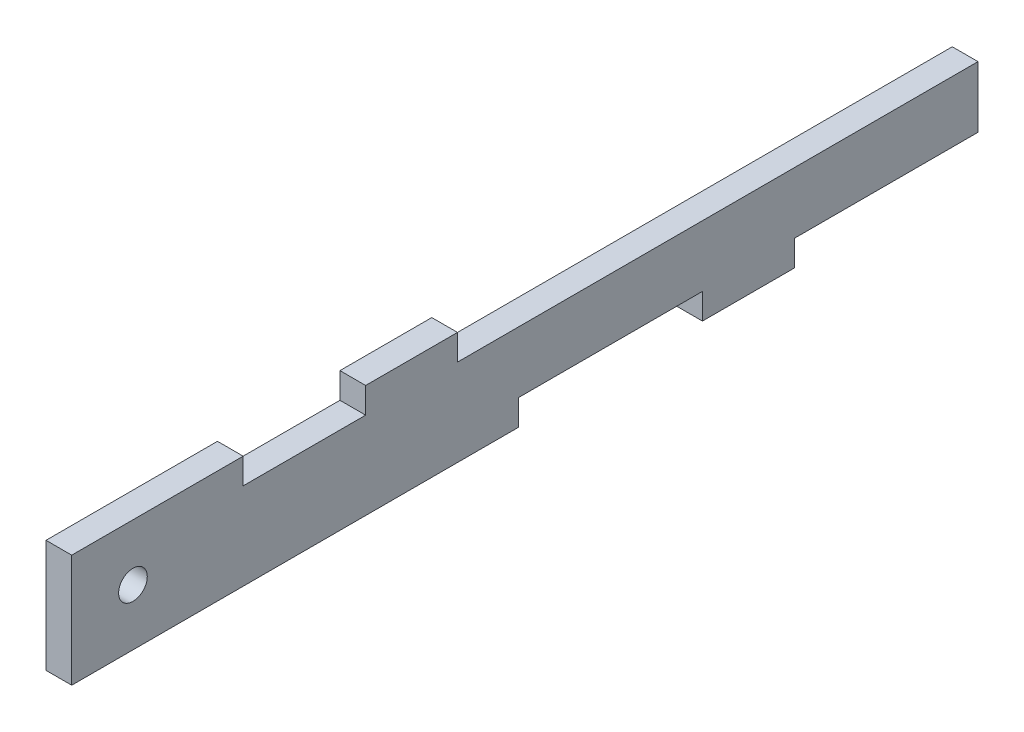
ISO-10303-21;
HEADER;
FILE_DESCRIPTION(('STEP AP214'),'2;1');
FILE_NAME('part.step','',(''),(''),'','','');
FILE_SCHEMA(('AUTOMOTIVE_DESIGN { 1 0 10303 214 1 1 1 1 }'));
ENDSEC;
DATA;
#1=APPLICATION_CONTEXT('core data for automotive mechanical design processes');
#2=APPLICATION_PROTOCOL_DEFINITION('international standard','automotive_design',2000,#1);
#3=PRODUCT_CONTEXT('',#1,'mechanical');
#4=PRODUCT('Part','Part','',(#3));
#5=PRODUCT_RELATED_PRODUCT_CATEGORY('part','',(#4));
#6=PRODUCT_DEFINITION_FORMATION('','',#4);
#7=PRODUCT_DEFINITION_CONTEXT('part definition',#1,'design');
#8=PRODUCT_DEFINITION('design','',#6,#7);
#9=PRODUCT_DEFINITION_SHAPE('','',#8);
#10=(LENGTH_UNIT() NAMED_UNIT(*) SI_UNIT(.MILLI.,.METRE.));
#11=(NAMED_UNIT(*) PLANE_ANGLE_UNIT() SI_UNIT($,.RADIAN.));
#12=(NAMED_UNIT(*) SI_UNIT($,.STERADIAN.) SOLID_ANGLE_UNIT());
#13=UNCERTAINTY_MEASURE_WITH_UNIT(LENGTH_MEASURE(1.E-05),#10,'distance_accuracy_value','');
#14=(GEOMETRIC_REPRESENTATION_CONTEXT(3) GLOBAL_UNCERTAINTY_ASSIGNED_CONTEXT((#13)) GLOBAL_UNIT_ASSIGNED_CONTEXT((#10,
#11,#12)) REPRESENTATION_CONTEXT('',''));
#15=CARTESIAN_POINT('',(0.,0.,0.));
#16=DIRECTION('',(0.,0.,1.));
#17=DIRECTION('',(1.,0.,0.));
#18=AXIS2_PLACEMENT_3D('',#15,#16,#17);
#19=CARTESIAN_POINT('',(5.334,0.,0.));
#20=DIRECTION('',(0.,1.,0.));
#21=DIRECTION('',(0.,0.,1.));
#22=AXIS2_PLACEMENT_3D('',#19,#20,#21);
#23=PLANE('',#22);
#24=DIRECTION('',(0.,0.,-1.));
#25=VECTOR('',#24,1.);
#26=CARTESIAN_POINT('',(0.,0.,0.));
#27=LINE('',#26,#25);
#28=CARTESIAN_POINT('',(0.,0.,0.));
#29=VERTEX_POINT('',#28);
#30=CARTESIAN_POINT('',(0.,0.,-92.71));
#31=VERTEX_POINT('',#30);
#32=EDGE_CURVE('E194',#29,#31,#27,.T.);
#33=ORIENTED_EDGE('',*,*,#32,.T.);
#34=DIRECTION('',(1.,0.,0.));
#35=VECTOR('',#34,1.);
#36=CARTESIAN_POINT('',(0.,0.,-92.71));
#37=LINE('',#36,#35);
#38=CARTESIAN_POINT('',(5.334,0.,-92.71));
#39=VERTEX_POINT('',#38);
#40=EDGE_CURVE('E237',#31,#39,#37,.T.);
#41=ORIENTED_EDGE('',*,*,#40,.T.);
#42=DIRECTION('',(0.,0.,-1.));
#43=VECTOR('',#42,1.);
#44=CARTESIAN_POINT('',(5.334,0.,0.));
#45=LINE('',#44,#43);
#46=CARTESIAN_POINT('',(5.334,0.,0.));
#47=VERTEX_POINT('',#46);
#48=EDGE_CURVE('E270',#47,#39,#45,.T.);
#49=ORIENTED_EDGE('',*,*,#48,.F.);
#50=DIRECTION('',(-1.,0.,0.));
#51=VECTOR('',#50,1.);
#52=CARTESIAN_POINT('',(5.334,0.,0.));
#53=LINE('',#52,#51);
#54=EDGE_CURVE('E11',#47,#29,#53,.T.);
#55=ORIENTED_EDGE('',*,*,#54,.T.);
#56=EDGE_LOOP('',(#33,#41,#49,#55));
#57=FACE_BOUND('',#56,.T.);
#58=ADVANCED_FACE('F32',(#57),#23,.F.);
#59=CARTESIAN_POINT('',(5.334,23.368,0.));
#60=DIRECTION('',(0.,-1.,0.));
#61=DIRECTION('',(0.,0.,-1.));
#62=AXIS2_PLACEMENT_3D('',#59,#60,#61);
#63=PLANE('',#62);
#64=DIRECTION('',(0.,0.,1.));
#65=VECTOR('',#64,1.);
#66=CARTESIAN_POINT('',(5.334,23.368,0.));
#67=LINE('',#66,#65);
#68=CARTESIAN_POINT('',(5.334,23.368,-35.5600000000001));
#69=VERTEX_POINT('',#68);
#70=CARTESIAN_POINT('',(5.334,23.368,0.));
#71=VERTEX_POINT('',#70);
#72=EDGE_CURVE('E182',#69,#71,#67,.T.);
#73=ORIENTED_EDGE('',*,*,#72,.F.);
#74=DIRECTION('',(1.,0.,0.));
#75=VECTOR('',#74,1.);
#76=CARTESIAN_POINT('',(0.,23.368,-35.5600000000001));
#77=LINE('',#76,#75);
#78=CARTESIAN_POINT('',(0.,23.368,-35.5600000000001));
#79=VERTEX_POINT('',#78);
#80=EDGE_CURVE('E193',#79,#69,#77,.T.);
#81=ORIENTED_EDGE('',*,*,#80,.F.);
#82=DIRECTION('',(0.,0.,1.));
#83=VECTOR('',#82,1.);
#84=CARTESIAN_POINT('',(0.,23.368,0.));
#85=LINE('',#84,#83);
#86=CARTESIAN_POINT('',(0.,23.368,0.));
#87=VERTEX_POINT('',#86);
#88=EDGE_CURVE('E168',#79,#87,#85,.T.);
#89=ORIENTED_EDGE('',*,*,#88,.T.);
#90=DIRECTION('',(-1.,0.,0.));
#91=VECTOR('',#90,1.);
#92=CARTESIAN_POINT('',(5.334,23.368,0.));
#93=LINE('',#92,#91);
#94=EDGE_CURVE('E40',#71,#87,#93,.T.);
#95=ORIENTED_EDGE('',*,*,#94,.F.);
#96=EDGE_LOOP('',(#73,#81,#89,#95));
#97=FACE_BOUND('',#96,.T.);
#98=ADVANCED_FACE('F293',(#97),#63,.F.);
#99=CARTESIAN_POINT('',(5.334,0.,0.));
#100=DIRECTION('',(0.,0.,-1.));
#101=DIRECTION('',(0.,1.,0.));
#102=AXIS2_PLACEMENT_3D('',#99,#100,#101);
#103=PLANE('',#102);
#104=DIRECTION('',(0.,-1.,0.));
#105=VECTOR('',#104,1.);
#106=CARTESIAN_POINT('',(0.,0.,0.));
#107=LINE('',#106,#105);
#108=EDGE_CURVE('E191',#87,#29,#107,.T.);
#109=ORIENTED_EDGE('',*,*,#108,.T.);
#110=ORIENTED_EDGE('',*,*,#54,.F.);
#111=DIRECTION('',(0.,-1.,0.));
#112=VECTOR('',#111,1.);
#113=CARTESIAN_POINT('',(5.334,0.,0.));
#114=LINE('',#113,#112);
#115=EDGE_CURVE('E167',#71,#47,#114,.T.);
#116=ORIENTED_EDGE('',*,*,#115,.F.);
#117=ORIENTED_EDGE('',*,*,#94,.T.);
#118=EDGE_LOOP('',(#109,#110,#116,#117));
#119=FACE_BOUND('',#118,.T.);
#120=ADVANCED_FACE('F34',(#119),#103,.F.);
#121=CARTESIAN_POINT('',(0.,0.,-130.81));
#122=VERTEX_POINT('',#121);
#123=CARTESIAN_POINT('',(0.,0.,-149.86));
#124=VERTEX_POINT('',#123);
#125=EDGE_CURVE('E192',#122,#124,#27,.T.);
#126=ORIENTED_EDGE('',*,*,#125,.T.);
#127=DIRECTION('',(1.,0.,0.));
#128=VECTOR('',#127,1.);
#129=CARTESIAN_POINT('',(0.,0.,-149.86));
#130=LINE('',#129,#128);
#131=CARTESIAN_POINT('',(5.334,0.,-149.86));
#132=VERTEX_POINT('',#131);
#133=EDGE_CURVE('E206',#124,#132,#130,.T.);
#134=ORIENTED_EDGE('',*,*,#133,.T.);
#135=CARTESIAN_POINT('',(5.334,0.,-130.81));
#136=VERTEX_POINT('',#135);
#137=EDGE_CURVE('E171',#136,#132,#45,.T.);
#138=ORIENTED_EDGE('',*,*,#137,.F.);
#139=DIRECTION('',(1.,0.,0.));
#140=VECTOR('',#139,1.);
#141=CARTESIAN_POINT('',(0.,0.,-130.81));
#142=LINE('',#141,#140);
#143=EDGE_CURVE('E208',#122,#136,#142,.T.);
#144=ORIENTED_EDGE('',*,*,#143,.F.);
#145=EDGE_LOOP('',(#126,#134,#138,#144));
#146=FACE_BOUND('',#145,.T.);
#147=ADVANCED_FACE('F204',(#146),#23,.F.);
#148=CARTESIAN_POINT('',(5.334,0.,-187.96));
#149=DIRECTION('',(0.,0.,1.));
#150=DIRECTION('',(0.,-1.,0.));
#151=AXIS2_PLACEMENT_3D('',#148,#149,#150);
#152=PLANE('',#151);
#153=DIRECTION('',(0.,1.,0.));
#154=VECTOR('',#153,1.);
#155=CARTESIAN_POINT('',(0.,0.,-187.96));
#156=LINE('',#155,#154);
#157=CARTESIAN_POINT('',(0.,5.334,-187.96));
#158=VERTEX_POINT('',#157);
#159=CARTESIAN_POINT('',(0.,18.034,-187.96));
#160=VERTEX_POINT('',#159);
#161=EDGE_CURVE('E173',#158,#160,#156,.T.);
#162=ORIENTED_EDGE('',*,*,#161,.T.);
#163=DIRECTION('',(1.,0.,0.));
#164=VECTOR('',#163,1.);
#165=CARTESIAN_POINT('',(0.,18.034,-187.96));
#166=LINE('',#165,#164);
#167=CARTESIAN_POINT('',(5.334,18.034,-187.96));
#168=VERTEX_POINT('',#167);
#169=EDGE_CURVE('E225',#160,#168,#166,.T.);
#170=ORIENTED_EDGE('',*,*,#169,.T.);
#171=DIRECTION('',(0.,1.,0.));
#172=VECTOR('',#171,1.);
#173=CARTESIAN_POINT('',(5.334,0.,-187.96));
#174=LINE('',#173,#172);
#175=CARTESIAN_POINT('',(5.334,5.334,-187.96));
#176=VERTEX_POINT('',#175);
#177=EDGE_CURVE('E187',#176,#168,#174,.T.);
#178=ORIENTED_EDGE('',*,*,#177,.F.);
#179=DIRECTION('',(1.,0.,0.));
#180=VECTOR('',#179,1.);
#181=CARTESIAN_POINT('',(0.,5.334,-187.96));
#182=LINE('',#181,#180);
#183=EDGE_CURVE('E215',#158,#176,#182,.T.);
#184=ORIENTED_EDGE('',*,*,#183,.F.);
#185=EDGE_LOOP('',(#162,#170,#178,#184));
#186=FACE_BOUND('',#185,.T.);
#187=ADVANCED_FACE('F319',(#186),#152,.F.);
#188=CARTESIAN_POINT('',(5.334,23.368,-80.0100000000001));
#189=VERTEX_POINT('',#188);
#190=CARTESIAN_POINT('',(5.334,23.368,-60.9600000000001));
#191=VERTEX_POINT('',#190);
#192=EDGE_CURVE('E161',#189,#191,#67,.T.);
#193=ORIENTED_EDGE('',*,*,#192,.F.);
#194=DIRECTION('',(1.,0.,0.));
#195=VECTOR('',#194,1.);
#196=CARTESIAN_POINT('',(0.,23.368,-80.0100000000001));
#197=LINE('',#196,#195);
#198=CARTESIAN_POINT('',(0.,23.368,-80.0100000000001));
#199=VERTEX_POINT('',#198);
#200=EDGE_CURVE('E148',#199,#189,#197,.T.);
#201=ORIENTED_EDGE('',*,*,#200,.F.);
#202=CARTESIAN_POINT('',(0.,23.368,-60.9600000000001));
#203=VERTEX_POINT('',#202);
#204=EDGE_CURVE('E159',#199,#203,#85,.T.);
#205=ORIENTED_EDGE('',*,*,#204,.T.);
#206=DIRECTION('',(1.,0.,0.));
#207=VECTOR('',#206,1.);
#208=CARTESIAN_POINT('',(0.,23.368,-60.9600000000001));
#209=LINE('',#208,#207);
#210=EDGE_CURVE('E266',#203,#191,#209,.T.);
#211=ORIENTED_EDGE('',*,*,#210,.T.);
#212=EDGE_LOOP('',(#193,#201,#205,#211));
#213=FACE_BOUND('',#212,.T.);
#214=ADVANCED_FACE('F157',(#213),#63,.F.);
#215=CARTESIAN_POINT('',(5.334,0.,0.));
#216=DIRECTION('',(-1.,0.,0.));
#217=DIRECTION('',(0.,0.,1.));
#218=AXIS2_PLACEMENT_3D('',#215,#216,#217);
#219=PLANE('',#218);
#220=CARTESIAN_POINT('',(5.334,11.684,-12.7));
#221=DIRECTION('',(1.,0.,0.));
#222=DIRECTION('',(0.,0.,-1.));
#223=AXIS2_PLACEMENT_3D('',#220,#221,#222);
#224=CIRCLE('',#223,2.9718);
#225=CARTESIAN_POINT('',(5.334,11.684,-15.6718));
#226=VERTEX_POINT('',#225);
#227=EDGE_CURVE('E463',#226,#226,#224,.T.);
#228=ORIENTED_EDGE('',*,*,#227,.F.);
#229=EDGE_LOOP('',(#228));
#230=FACE_BOUND('',#229,.T.);
#231=ORIENTED_EDGE('',*,*,#177,.T.);
#232=DIRECTION('',(0.,0.,-1.));
#233=VECTOR('',#232,1.);
#234=CARTESIAN_POINT('',(5.334,18.034,-187.96));
#235=LINE('',#234,#233);
#236=CARTESIAN_POINT('',(5.334,18.034,-80.0100000000001));
#237=VERTEX_POINT('',#236);
#238=EDGE_CURVE('E153',#237,#168,#235,.T.);
#239=ORIENTED_EDGE('',*,*,#238,.F.);
#240=DIRECTION('',(0.,-1.,0.));
#241=VECTOR('',#240,1.);
#242=CARTESIAN_POINT('',(5.334,23.368,-80.0100000000001));
#243=LINE('',#242,#241);
#244=EDGE_CURVE('E465',#189,#237,#243,.T.);
#245=ORIENTED_EDGE('',*,*,#244,.F.);
#246=ORIENTED_EDGE('',*,*,#192,.T.);
#247=DIRECTION('',(0.,1.,0.));
#248=VECTOR('',#247,1.);
#249=CARTESIAN_POINT('',(5.334,23.368,-60.9600000000001));
#250=LINE('',#249,#248);
#251=CARTESIAN_POINT('',(5.334,18.034,-60.9600000000001));
#252=VERTEX_POINT('',#251);
#253=EDGE_CURVE('E255',#252,#191,#250,.T.);
#254=ORIENTED_EDGE('',*,*,#253,.F.);
#255=DIRECTION('',(0.,0.,-1.));
#256=VECTOR('',#255,1.);
#257=CARTESIAN_POINT('',(5.334,18.034,-60.9600000000001));
#258=LINE('',#257,#256);
#259=CARTESIAN_POINT('',(5.334,18.034,-35.5600000000001));
#260=VERTEX_POINT('',#259);
#261=EDGE_CURVE('E261',#260,#252,#258,.T.);
#262=ORIENTED_EDGE('',*,*,#261,.F.);
#263=DIRECTION('',(0.,-1.,0.));
#264=VECTOR('',#263,1.);
#265=CARTESIAN_POINT('',(5.334,18.034,-35.5600000000001));
#266=LINE('',#265,#264);
#267=EDGE_CURVE('E246',#69,#260,#266,.T.);
#268=ORIENTED_EDGE('',*,*,#267,.F.);
#269=ORIENTED_EDGE('',*,*,#72,.T.);
#270=ORIENTED_EDGE('',*,*,#115,.T.);
#271=ORIENTED_EDGE('',*,*,#48,.T.);
#272=DIRECTION('',(0.,-1.,0.));
#273=VECTOR('',#272,1.);
#274=CARTESIAN_POINT('',(5.334,0.,-92.71));
#275=LINE('',#274,#273);
#276=CARTESIAN_POINT('',(5.334,5.334,-92.71));
#277=VERTEX_POINT('',#276);
#278=EDGE_CURVE('E228',#277,#39,#275,.T.);
#279=ORIENTED_EDGE('',*,*,#278,.F.);
#280=DIRECTION('',(0.,0.,1.));
#281=VECTOR('',#280,1.);
#282=CARTESIAN_POINT('',(5.334,5.334,-92.71));
#283=LINE('',#282,#281);
#284=CARTESIAN_POINT('',(5.334,5.334,-130.81));
#285=VERTEX_POINT('',#284);
#286=EDGE_CURVE('E233',#285,#277,#283,.T.);
#287=ORIENTED_EDGE('',*,*,#286,.F.);
#288=DIRECTION('',(0.,1.,0.));
#289=VECTOR('',#288,1.);
#290=CARTESIAN_POINT('',(5.334,0.,-130.81));
#291=LINE('',#290,#289);
#292=EDGE_CURVE('E239',#136,#285,#291,.T.);
#293=ORIENTED_EDGE('',*,*,#292,.F.);
#294=ORIENTED_EDGE('',*,*,#137,.T.);
#295=DIRECTION('',(0.,-1.,0.));
#296=VECTOR('',#295,1.);
#297=CARTESIAN_POINT('',(5.334,0.,-149.86));
#298=LINE('',#297,#296);
#299=CARTESIAN_POINT('',(5.334,5.334,-149.86));
#300=VERTEX_POINT('',#299);
#301=EDGE_CURVE('E219',#300,#132,#298,.T.);
#302=ORIENTED_EDGE('',*,*,#301,.F.);
#303=DIRECTION('',(0.,0.,1.));
#304=VECTOR('',#303,1.);
#305=CARTESIAN_POINT('',(5.334,5.334,-187.96));
#306=LINE('',#305,#304);
#307=EDGE_CURVE('E222',#176,#300,#306,.T.);
#308=ORIENTED_EDGE('',*,*,#307,.F.);
#309=EDGE_LOOP('',(#231,#239,#245,#246,#254,#262,#268,#269,#270,#271,#279,#287,#293,#294,#302,#308));
#310=FACE_BOUND('',#309,.T.);
#311=ADVANCED_FACE('F276',(#230,#310),#219,.F.);
#312=CARTESIAN_POINT('',(0.,0.,0.));
#313=DIRECTION('',(-1.,0.,0.));
#314=DIRECTION('',(0.,0.,1.));
#315=AXIS2_PLACEMENT_3D('',#312,#313,#314);
#316=PLANE('',#315);
#317=CARTESIAN_POINT('',(0.,11.684,-12.7));
#318=DIRECTION('',(1.,0.,0.));
#319=DIRECTION('',(0.,0.,-1.));
#320=AXIS2_PLACEMENT_3D('',#317,#318,#319);
#321=CIRCLE('',#320,2.9718);
#322=CARTESIAN_POINT('',(0.,11.684,-15.6718));
#323=VERTEX_POINT('',#322);
#324=EDGE_CURVE('E460',#323,#323,#321,.T.);
#325=ORIENTED_EDGE('',*,*,#324,.T.);
#326=EDGE_LOOP('',(#325));
#327=FACE_BOUND('',#326,.T.);
#328=DIRECTION('',(0.,0.,-1.));
#329=VECTOR('',#328,1.);
#330=CARTESIAN_POINT('',(0.,18.034,-187.96));
#331=LINE('',#330,#329);
#332=CARTESIAN_POINT('',(0.,18.034,-80.0100000000001));
#333=VERTEX_POINT('',#332);
#334=EDGE_CURVE('E47',#333,#160,#331,.T.);
#335=ORIENTED_EDGE('',*,*,#334,.T.);
#336=ORIENTED_EDGE('',*,*,#161,.F.);
#337=DIRECTION('',(0.,0.,1.));
#338=VECTOR('',#337,1.);
#339=CARTESIAN_POINT('',(0.,5.334,-187.96));
#340=LINE('',#339,#338);
#341=CARTESIAN_POINT('',(0.,5.334,-149.86));
#342=VERTEX_POINT('',#341);
#343=EDGE_CURVE('E214',#158,#342,#340,.T.);
#344=ORIENTED_EDGE('',*,*,#343,.T.);
#345=DIRECTION('',(0.,-1.,0.));
#346=VECTOR('',#345,1.);
#347=CARTESIAN_POINT('',(0.,0.,-149.86));
#348=LINE('',#347,#346);
#349=EDGE_CURVE('E55',#342,#124,#348,.T.);
#350=ORIENTED_EDGE('',*,*,#349,.T.);
#351=ORIENTED_EDGE('',*,*,#125,.F.);
#352=DIRECTION('',(0.,1.,0.));
#353=VECTOR('',#352,1.);
#354=CARTESIAN_POINT('',(0.,0.,-130.81));
#355=LINE('',#354,#353);
#356=CARTESIAN_POINT('',(0.,5.334,-130.81));
#357=VERTEX_POINT('',#356);
#358=EDGE_CURVE('E211',#122,#357,#355,.T.);
#359=ORIENTED_EDGE('',*,*,#358,.T.);
#360=DIRECTION('',(0.,0.,1.));
#361=VECTOR('',#360,1.);
#362=CARTESIAN_POINT('',(0.,5.334,-92.71));
#363=LINE('',#362,#361);
#364=CARTESIAN_POINT('',(0.,5.334,-92.71));
#365=VERTEX_POINT('',#364);
#366=EDGE_CURVE('E235',#357,#365,#363,.T.);
#367=ORIENTED_EDGE('',*,*,#366,.T.);
#368=DIRECTION('',(0.,-1.,0.));
#369=VECTOR('',#368,1.);
#370=CARTESIAN_POINT('',(0.,0.,-92.71));
#371=LINE('',#370,#369);
#372=EDGE_CURVE('E230',#365,#31,#371,.T.);
#373=ORIENTED_EDGE('',*,*,#372,.T.);
#374=ORIENTED_EDGE('',*,*,#32,.F.);
#375=ORIENTED_EDGE('',*,*,#108,.F.);
#376=ORIENTED_EDGE('',*,*,#88,.F.);
#377=DIRECTION('',(0.,-1.,0.));
#378=VECTOR('',#377,1.);
#379=CARTESIAN_POINT('',(0.,18.034,-35.5600000000001));
#380=LINE('',#379,#378);
#381=CARTESIAN_POINT('',(0.,18.034,-35.5600000000001));
#382=VERTEX_POINT('',#381);
#383=EDGE_CURVE('E251',#79,#382,#380,.T.);
#384=ORIENTED_EDGE('',*,*,#383,.T.);
#385=DIRECTION('',(0.,0.,-1.));
#386=VECTOR('',#385,1.);
#387=CARTESIAN_POINT('',(0.,18.034,-60.9600000000001));
#388=LINE('',#387,#386);
#389=CARTESIAN_POINT('',(0.,18.034,-60.9600000000001));
#390=VERTEX_POINT('',#389);
#391=EDGE_CURVE('E254',#382,#390,#388,.T.);
#392=ORIENTED_EDGE('',*,*,#391,.T.);
#393=DIRECTION('',(0.,1.,0.));
#394=VECTOR('',#393,1.);
#395=CARTESIAN_POINT('',(0.,23.368,-60.9600000000001));
#396=LINE('',#395,#394);
#397=EDGE_CURVE('E166',#390,#203,#396,.T.);
#398=ORIENTED_EDGE('',*,*,#397,.T.);
#399=ORIENTED_EDGE('',*,*,#204,.F.);
#400=DIRECTION('',(0.,-1.,0.));
#401=VECTOR('',#400,1.);
#402=CARTESIAN_POINT('',(0.,23.368,-80.0100000000001));
#403=LINE('',#402,#401);
#404=EDGE_CURVE('E144',#199,#333,#403,.T.);
#405=ORIENTED_EDGE('',*,*,#404,.T.);
#406=EDGE_LOOP('',(#335,#336,#344,#350,#351,#359,#367,#373,#374,#375,#376,#384,#392,#398,#399,#405));
#407=FACE_BOUND('',#406,.T.);
#408=ADVANCED_FACE('F164',(#327,#407),#316,.T.);
#409=CARTESIAN_POINT('',(0.,18.034,-35.5600000000001));
#410=DIRECTION('',(0.,0.,1.));
#411=DIRECTION('',(0.,-1.,0.));
#412=AXIS2_PLACEMENT_3D('',#409,#410,#411);
#413=PLANE('',#412);
#414=ORIENTED_EDGE('',*,*,#267,.T.);
#415=DIRECTION('',(1.,0.,0.));
#416=VECTOR('',#415,1.);
#417=CARTESIAN_POINT('',(0.,18.034,-35.5600000000001));
#418=LINE('',#417,#416);
#419=EDGE_CURVE('E258',#382,#260,#418,.T.);
#420=ORIENTED_EDGE('',*,*,#419,.F.);
#421=ORIENTED_EDGE('',*,*,#383,.F.);
#422=ORIENTED_EDGE('',*,*,#80,.T.);
#423=EDGE_LOOP('',(#414,#420,#421,#422));
#424=FACE_BOUND('',#423,.T.);
#425=ADVANCED_FACE('F295',(#424),#413,.F.);
#426=CARTESIAN_POINT('',(0.,23.368,-60.9600000000001));
#427=DIRECTION('',(0.,0.,-1.));
#428=DIRECTION('',(0.,1.,0.));
#429=AXIS2_PLACEMENT_3D('',#426,#427,#428);
#430=PLANE('',#429);
#431=ORIENTED_EDGE('',*,*,#253,.T.);
#432=ORIENTED_EDGE('',*,*,#210,.F.);
#433=ORIENTED_EDGE('',*,*,#397,.F.);
#434=DIRECTION('',(1.,0.,0.));
#435=VECTOR('',#434,1.);
#436=CARTESIAN_POINT('',(0.,18.034,-60.9600000000001));
#437=LINE('',#436,#435);
#438=EDGE_CURVE('E268',#390,#252,#437,.T.);
#439=ORIENTED_EDGE('',*,*,#438,.T.);
#440=EDGE_LOOP('',(#431,#432,#433,#439));
#441=FACE_BOUND('',#440,.T.);
#442=ADVANCED_FACE('F302',(#441),#430,.F.);
#443=CARTESIAN_POINT('',(0.,18.034,-60.9600000000001));
#444=DIRECTION('',(0.,-1.,0.));
#445=DIRECTION('',(0.,0.,-1.));
#446=AXIS2_PLACEMENT_3D('',#443,#444,#445);
#447=PLANE('',#446);
#448=ORIENTED_EDGE('',*,*,#261,.T.);
#449=ORIENTED_EDGE('',*,*,#438,.F.);
#450=ORIENTED_EDGE('',*,*,#391,.F.);
#451=ORIENTED_EDGE('',*,*,#419,.T.);
#452=EDGE_LOOP('',(#448,#449,#450,#451));
#453=FACE_BOUND('',#452,.T.);
#454=ADVANCED_FACE('F299',(#453),#447,.F.);
#455=CARTESIAN_POINT('',(0.,0.,-92.71));
#456=DIRECTION('',(0.,0.,1.));
#457=DIRECTION('',(1.,0.,0.));
#458=AXIS2_PLACEMENT_3D('',#455,#456,#457);
#459=PLANE('',#458);
#460=ORIENTED_EDGE('',*,*,#278,.T.);
#461=ORIENTED_EDGE('',*,*,#40,.F.);
#462=ORIENTED_EDGE('',*,*,#372,.F.);
#463=DIRECTION('',(1.,0.,0.));
#464=VECTOR('',#463,1.);
#465=CARTESIAN_POINT('',(0.,5.334,-92.71));
#466=LINE('',#465,#464);
#467=EDGE_CURVE('E244',#365,#277,#466,.T.);
#468=ORIENTED_EDGE('',*,*,#467,.T.);
#469=EDGE_LOOP('',(#460,#461,#462,#468));
#470=FACE_BOUND('',#469,.T.);
#471=ADVANCED_FACE('F286',(#470),#459,.F.);
#472=CARTESIAN_POINT('',(0.,5.334,-92.71));
#473=DIRECTION('',(0.,1.,0.));
#474=DIRECTION('',(0.,0.,1.));
#475=AXIS2_PLACEMENT_3D('',#472,#473,#474);
#476=PLANE('',#475);
#477=ORIENTED_EDGE('',*,*,#286,.T.);
#478=ORIENTED_EDGE('',*,*,#467,.F.);
#479=ORIENTED_EDGE('',*,*,#366,.F.);
#480=DIRECTION('',(1.,0.,0.));
#481=VECTOR('',#480,1.);
#482=CARTESIAN_POINT('',(0.,5.334,-130.81));
#483=LINE('',#482,#481);
#484=EDGE_CURVE('E247',#357,#285,#483,.T.);
#485=ORIENTED_EDGE('',*,*,#484,.T.);
#486=EDGE_LOOP('',(#477,#478,#479,#485));
#487=FACE_BOUND('',#486,.T.);
#488=ADVANCED_FACE('F283',(#487),#476,.F.);
#489=CARTESIAN_POINT('',(0.,0.,-130.81));
#490=DIRECTION('',(0.,0.,-1.));
#491=DIRECTION('',(-1.,0.,0.));
#492=AXIS2_PLACEMENT_3D('',#489,#490,#491);
#493=PLANE('',#492);
#494=ORIENTED_EDGE('',*,*,#292,.T.);
#495=ORIENTED_EDGE('',*,*,#484,.F.);
#496=ORIENTED_EDGE('',*,*,#358,.F.);
#497=ORIENTED_EDGE('',*,*,#143,.T.);
#498=EDGE_LOOP('',(#494,#495,#496,#497));
#499=FACE_BOUND('',#498,.T.);
#500=ADVANCED_FACE('F281',(#499),#493,.F.);
#501=CARTESIAN_POINT('',(0.,0.,-149.86));
#502=DIRECTION('',(0.,0.,1.));
#503=DIRECTION('',(1.,0.,0.));
#504=AXIS2_PLACEMENT_3D('',#501,#502,#503);
#505=PLANE('',#504);
#506=ORIENTED_EDGE('',*,*,#301,.T.);
#507=ORIENTED_EDGE('',*,*,#133,.F.);
#508=ORIENTED_EDGE('',*,*,#349,.F.);
#509=DIRECTION('',(1.,0.,0.));
#510=VECTOR('',#509,1.);
#511=CARTESIAN_POINT('',(0.,5.334,-149.86));
#512=LINE('',#511,#510);
#513=EDGE_CURVE('E217',#342,#300,#512,.T.);
#514=ORIENTED_EDGE('',*,*,#513,.T.);
#515=EDGE_LOOP('',(#506,#507,#508,#514));
#516=FACE_BOUND('',#515,.T.);
#517=ADVANCED_FACE('F394',(#516),#505,.F.);
#518=CARTESIAN_POINT('',(0.,5.334,-187.96));
#519=DIRECTION('',(0.,1.,0.));
#520=DIRECTION('',(0.,0.,1.));
#521=AXIS2_PLACEMENT_3D('',#518,#519,#520);
#522=PLANE('',#521);
#523=ORIENTED_EDGE('',*,*,#307,.T.);
#524=ORIENTED_EDGE('',*,*,#513,.F.);
#525=ORIENTED_EDGE('',*,*,#343,.F.);
#526=ORIENTED_EDGE('',*,*,#183,.T.);
#527=EDGE_LOOP('',(#523,#524,#525,#526));
#528=FACE_BOUND('',#527,.T.);
#529=ADVANCED_FACE('F403',(#528),#522,.F.);
#530=CARTESIAN_POINT('',(0.,18.034,-187.96));
#531=DIRECTION('',(0.,-1.,0.));
#532=DIRECTION('',(0.,0.,-1.));
#533=AXIS2_PLACEMENT_3D('',#530,#531,#532);
#534=PLANE('',#533);
#535=ORIENTED_EDGE('',*,*,#238,.T.);
#536=ORIENTED_EDGE('',*,*,#169,.F.);
#537=ORIENTED_EDGE('',*,*,#334,.F.);
#538=DIRECTION('',(1.,0.,0.));
#539=VECTOR('',#538,1.);
#540=CARTESIAN_POINT('',(0.,18.034,-80.0100000000001));
#541=LINE('',#540,#539);
#542=EDGE_CURVE('E150',#333,#237,#541,.T.);
#543=ORIENTED_EDGE('',*,*,#542,.T.);
#544=EDGE_LOOP('',(#535,#536,#537,#543));
#545=FACE_BOUND('',#544,.T.);
#546=ADVANCED_FACE('F412',(#545),#534,.F.);
#547=CARTESIAN_POINT('',(0.,23.368,-80.0100000000001));
#548=DIRECTION('',(0.,0.,1.));
#549=DIRECTION('',(1.,0.,0.));
#550=AXIS2_PLACEMENT_3D('',#547,#548,#549);
#551=PLANE('',#550);
#552=ORIENTED_EDGE('',*,*,#244,.T.);
#553=ORIENTED_EDGE('',*,*,#542,.F.);
#554=ORIENTED_EDGE('',*,*,#404,.F.);
#555=ORIENTED_EDGE('',*,*,#200,.T.);
#556=EDGE_LOOP('',(#552,#553,#554,#555));
#557=FACE_BOUND('',#556,.T.);
#558=ADVANCED_FACE('F147',(#557),#551,.F.);
#559=CARTESIAN_POINT('',(0.,11.684,-12.7));
#560=DIRECTION('',(1.,0.,0.));
#561=DIRECTION('',(0.,0.,-1.));
#562=AXIS2_PLACEMENT_3D('',#559,#560,#561);
#563=CYLINDRICAL_SURFACE('',#562,2.9718);
#564=ORIENTED_EDGE('',*,*,#324,.F.);
#565=EDGE_LOOP('',(#564));
#566=FACE_BOUND('',#565,.T.);
#567=ORIENTED_EDGE('',*,*,#227,.T.);
#568=EDGE_LOOP('',(#567));
#569=FACE_BOUND('',#568,.T.);
#570=ADVANCED_FACE('F430',(#566,#569),#563,.F.);
#571=CLOSED_SHELL('',(#58,#98,#120,#147,#187,#214,#311,#408,#425,#442,#454,#471,#488,#500,#517,
#529,#546,#558,#570));
#572=MANIFOLD_SOLID_BREP('B2',#571);
#573=ADVANCED_BREP_SHAPE_REPRESENTATION('',(#18,#572),#14);
#574=SHAPE_DEFINITION_REPRESENTATION(#9,#573);
ENDSEC;
END-ISO-10303-21;
